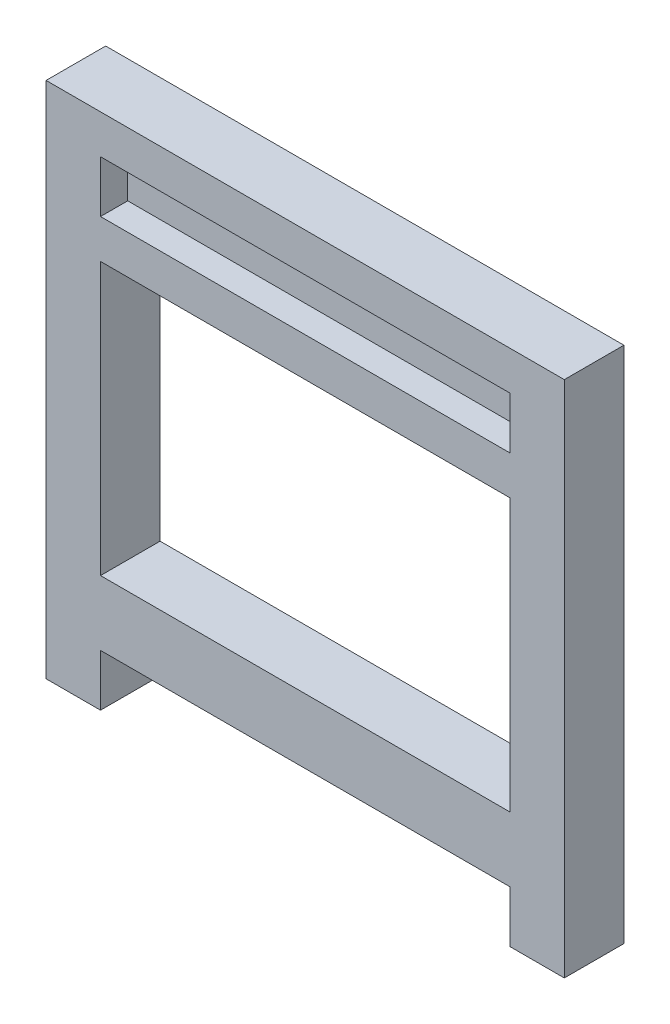
ISO-10303-21;
HEADER;
FILE_DESCRIPTION(('STEP AP214'),'2;1');
FILE_NAME('part.step','',(''),(''),'','','');
FILE_SCHEMA(('AUTOMOTIVE_DESIGN { 1 0 10303 214 1 1 1 1 }'));
ENDSEC;
DATA;
#1=APPLICATION_CONTEXT('core data for automotive mechanical design processes');
#2=APPLICATION_PROTOCOL_DEFINITION('international standard','automotive_design',2000,#1);
#3=PRODUCT_CONTEXT('',#1,'mechanical');
#4=PRODUCT('Part','Part','',(#3));
#5=PRODUCT_RELATED_PRODUCT_CATEGORY('part','',(#4));
#6=PRODUCT_DEFINITION_FORMATION('','',#4);
#7=PRODUCT_DEFINITION_CONTEXT('part definition',#1,'design');
#8=PRODUCT_DEFINITION('design','',#6,#7);
#9=PRODUCT_DEFINITION_SHAPE('','',#8);
#10=(LENGTH_UNIT() NAMED_UNIT(*) SI_UNIT(.MILLI.,.METRE.));
#11=(NAMED_UNIT(*) PLANE_ANGLE_UNIT() SI_UNIT($,.RADIAN.));
#12=(NAMED_UNIT(*) SI_UNIT($,.STERADIAN.) SOLID_ANGLE_UNIT());
#13=UNCERTAINTY_MEASURE_WITH_UNIT(LENGTH_MEASURE(1.E-05),#10,'distance_accuracy_value','');
#14=(GEOMETRIC_REPRESENTATION_CONTEXT(3) GLOBAL_UNCERTAINTY_ASSIGNED_CONTEXT((#13)) GLOBAL_UNIT_ASSIGNED_CONTEXT((#10,
#11,#12)) REPRESENTATION_CONTEXT('',''));
#15=CARTESIAN_POINT('',(0.,0.,0.));
#16=DIRECTION('',(0.,0.,1.));
#17=DIRECTION('',(1.,0.,0.));
#18=AXIS2_PLACEMENT_3D('',#15,#16,#17);
#19=CARTESIAN_POINT('',(2.1,14.5,2.3));
#20=DIRECTION('',(1.,0.,0.));
#21=DIRECTION('',(0.,0.,-1.));
#22=AXIS2_PLACEMENT_3D('',#19,#20,#21);
#23=PLANE('',#22);
#24=DIRECTION('',(0.,0.,-1.));
#25=VECTOR('',#24,1.);
#26=CARTESIAN_POINT('',(2.1,14.5,2.3));
#27=LINE('',#26,#25);
#28=CARTESIAN_POINT('',(2.1,14.5,2.3));
#29=VERTEX_POINT('',#28);
#30=CARTESIAN_POINT('',(2.1,14.5,1.25));
#31=VERTEX_POINT('',#30);
#32=EDGE_CURVE('E170',#29,#31,#27,.T.);
#33=ORIENTED_EDGE('',*,*,#32,.T.);
#34=DIRECTION('',(0.,1.,0.));
#35=VECTOR('',#34,1.);
#36=CARTESIAN_POINT('',(2.1,14.5,1.25));
#37=LINE('',#36,#35);
#38=CARTESIAN_POINT('',(2.1,16.5,1.25));
#39=VERTEX_POINT('',#38);
#40=EDGE_CURVE('E159',#31,#39,#37,.T.);
#41=ORIENTED_EDGE('',*,*,#40,.T.);
#42=DIRECTION('',(0.,0.,-1.));
#43=VECTOR('',#42,1.);
#44=CARTESIAN_POINT('',(2.1,16.5,2.3));
#45=LINE('',#44,#43);
#46=CARTESIAN_POINT('',(2.1,16.5,2.3));
#47=VERTEX_POINT('',#46);
#48=EDGE_CURVE('E167',#47,#39,#45,.T.);
#49=ORIENTED_EDGE('',*,*,#48,.F.);
#50=DIRECTION('',(0.,-1.,0.));
#51=VECTOR('',#50,1.);
#52=CARTESIAN_POINT('',(2.1,14.5,2.3));
#53=LINE('',#52,#51);
#54=EDGE_CURVE('E529',#47,#29,#53,.T.);
#55=ORIENTED_EDGE('',*,*,#54,.T.);
#56=EDGE_LOOP('',(#33,#41,#49,#55));
#57=FACE_BOUND('',#56,.T.);
#58=ADVANCED_FACE('F45',(#57),#23,.T.);
#59=CARTESIAN_POINT('',(2.1,14.5,2.3));
#60=DIRECTION('',(0.,1.,0.));
#61=DIRECTION('',(0.,0.,1.));
#62=AXIS2_PLACEMENT_3D('',#59,#60,#61);
#63=PLANE('',#62);
#64=DIRECTION('',(0.,0.,-1.));
#65=VECTOR('',#64,1.);
#66=CARTESIAN_POINT('',(17.9,14.5,2.3));
#67=LINE('',#66,#65);
#68=CARTESIAN_POINT('',(17.9,14.5,2.3));
#69=VERTEX_POINT('',#68);
#70=CARTESIAN_POINT('',(17.9,14.5,1.25));
#71=VERTEX_POINT('',#70);
#72=EDGE_CURVE('E180',#69,#71,#67,.T.);
#73=ORIENTED_EDGE('',*,*,#72,.T.);
#74=DIRECTION('',(1.,0.,0.));
#75=VECTOR('',#74,1.);
#76=CARTESIAN_POINT('',(2.1,14.5,1.25));
#77=LINE('',#76,#75);
#78=EDGE_CURVE('E531',#31,#71,#77,.T.);
#79=ORIENTED_EDGE('',*,*,#78,.F.);
#80=ORIENTED_EDGE('',*,*,#32,.F.);
#81=DIRECTION('',(1.,0.,0.));
#82=VECTOR('',#81,1.);
#83=CARTESIAN_POINT('',(2.1,14.5,2.3));
#84=LINE('',#83,#82);
#85=EDGE_CURVE('E528',#29,#69,#84,.T.);
#86=ORIENTED_EDGE('',*,*,#85,.T.);
#87=EDGE_LOOP('',(#73,#79,#80,#86));
#88=FACE_BOUND('',#87,.T.);
#89=ADVANCED_FACE('F361',(#88),#63,.T.);
#90=CARTESIAN_POINT('',(17.9,14.5,2.3));
#91=DIRECTION('',(-1.,0.,0.));
#92=DIRECTION('',(0.,0.,1.));
#93=AXIS2_PLACEMENT_3D('',#90,#91,#92);
#94=PLANE('',#93);
#95=DIRECTION('',(0.,0.,-1.));
#96=VECTOR('',#95,1.);
#97=CARTESIAN_POINT('',(17.9,16.5,2.3));
#98=LINE('',#97,#96);
#99=CARTESIAN_POINT('',(17.9,16.5,2.3));
#100=VERTEX_POINT('',#99);
#101=CARTESIAN_POINT('',(17.9,16.5,1.25));
#102=VERTEX_POINT('',#101);
#103=EDGE_CURVE('E68',#100,#102,#98,.T.);
#104=ORIENTED_EDGE('',*,*,#103,.T.);
#105=DIRECTION('',(0.,1.,0.));
#106=VECTOR('',#105,1.);
#107=CARTESIAN_POINT('',(17.9,14.5,1.25));
#108=LINE('',#107,#106);
#109=EDGE_CURVE('E61',#71,#102,#108,.T.);
#110=ORIENTED_EDGE('',*,*,#109,.F.);
#111=ORIENTED_EDGE('',*,*,#72,.F.);
#112=DIRECTION('',(0.,1.,0.));
#113=VECTOR('',#112,1.);
#114=CARTESIAN_POINT('',(17.9,14.5,2.3));
#115=LINE('',#114,#113);
#116=EDGE_CURVE('E182',#69,#100,#115,.T.);
#117=ORIENTED_EDGE('',*,*,#116,.T.);
#118=EDGE_LOOP('',(#104,#110,#111,#117));
#119=FACE_BOUND('',#118,.T.);
#120=ADVANCED_FACE('F367',(#119),#94,.T.);
#121=CARTESIAN_POINT('',(2.1,16.5,2.3));
#122=DIRECTION('',(0.,-1.,0.));
#123=DIRECTION('',(0.,0.,-1.));
#124=AXIS2_PLACEMENT_3D('',#121,#122,#123);
#125=PLANE('',#124);
#126=ORIENTED_EDGE('',*,*,#48,.T.);
#127=DIRECTION('',(1.,0.,0.));
#128=VECTOR('',#127,1.);
#129=CARTESIAN_POINT('',(2.1,16.5,1.25));
#130=LINE('',#129,#128);
#131=EDGE_CURVE('E156',#39,#102,#130,.T.);
#132=ORIENTED_EDGE('',*,*,#131,.T.);
#133=ORIENTED_EDGE('',*,*,#103,.F.);
#134=DIRECTION('',(-1.,0.,0.));
#135=VECTOR('',#134,1.);
#136=CARTESIAN_POINT('',(2.1,16.5,2.3));
#137=LINE('',#136,#135);
#138=EDGE_CURVE('E175',#100,#47,#137,.T.);
#139=ORIENTED_EDGE('',*,*,#138,.T.);
#140=EDGE_LOOP('',(#126,#132,#133,#139));
#141=FACE_BOUND('',#140,.T.);
#142=ADVANCED_FACE('F173',(#141),#125,.T.);
#143=CARTESIAN_POINT('',(0.,0.,2.3));
#144=DIRECTION('',(0.,0.,-1.));
#145=DIRECTION('',(-1.,0.,0.));
#146=AXIS2_PLACEMENT_3D('',#143,#144,#145);
#147=PLANE('',#146);
#148=DIRECTION('',(0.,1.,0.));
#149=VECTOR('',#148,1.);
#150=CARTESIAN_POINT('',(17.9,2.5,2.3));
#151=LINE('',#150,#149);
#152=CARTESIAN_POINT('',(17.9,2.5,2.3));
#153=VERTEX_POINT('',#152);
#154=CARTESIAN_POINT('',(17.9,13.,2.3));
#155=VERTEX_POINT('',#154);
#156=EDGE_CURVE('E192',#153,#155,#151,.T.);
#157=ORIENTED_EDGE('',*,*,#156,.F.);
#158=DIRECTION('',(1.,0.,0.));
#159=VECTOR('',#158,1.);
#160=CARTESIAN_POINT('',(2.1,2.5,2.3));
#161=LINE('',#160,#159);
#162=CARTESIAN_POINT('',(2.1,2.5,2.3));
#163=VERTEX_POINT('',#162);
#164=EDGE_CURVE('E203',#163,#153,#161,.T.);
#165=ORIENTED_EDGE('',*,*,#164,.F.);
#166=DIRECTION('',(0.,-1.,0.));
#167=VECTOR('',#166,1.);
#168=CARTESIAN_POINT('',(2.1,2.5,2.3));
#169=LINE('',#168,#167);
#170=CARTESIAN_POINT('',(2.1,13.,2.3));
#171=VERTEX_POINT('',#170);
#172=EDGE_CURVE('E199',#171,#163,#169,.T.);
#173=ORIENTED_EDGE('',*,*,#172,.F.);
#174=DIRECTION('',(-1.,0.,0.));
#175=VECTOR('',#174,1.);
#176=CARTESIAN_POINT('',(2.1,13.,2.3));
#177=LINE('',#176,#175);
#178=EDGE_CURVE('E195',#155,#171,#177,.T.);
#179=ORIENTED_EDGE('',*,*,#178,.F.);
#180=EDGE_LOOP('',(#157,#165,#173,#179));
#181=FACE_BOUND('',#180,.T.);
#182=DIRECTION('',(0.,-1.,0.));
#183=VECTOR('',#182,1.);
#184=CARTESIAN_POINT('',(0.,0.,2.3));
#185=LINE('',#184,#183);
#186=CARTESIAN_POINT('',(0.,18.,2.3));
#187=VERTEX_POINT('',#186);
#188=CARTESIAN_POINT('',(0.,-2.,2.3));
#189=VERTEX_POINT('',#188);
#190=EDGE_CURVE('E235',#187,#189,#185,.T.);
#191=ORIENTED_EDGE('',*,*,#190,.T.);
#192=DIRECTION('',(1.,0.,0.));
#193=VECTOR('',#192,1.);
#194=CARTESIAN_POINT('',(0.,-2.,2.3));
#195=LINE('',#194,#193);
#196=CARTESIAN_POINT('',(2.1,-2.,2.3));
#197=VERTEX_POINT('',#196);
#198=EDGE_CURVE('E238',#189,#197,#195,.T.);
#199=ORIENTED_EDGE('',*,*,#198,.T.);
#200=DIRECTION('',(0.,1.,0.));
#201=VECTOR('',#200,1.);
#202=CARTESIAN_POINT('',(2.1,-2.,2.3));
#203=LINE('',#202,#201);
#204=CARTESIAN_POINT('',(2.1,0.,2.3));
#205=VERTEX_POINT('',#204);
#206=EDGE_CURVE('E242',#197,#205,#203,.T.);
#207=ORIENTED_EDGE('',*,*,#206,.T.);
#208=DIRECTION('',(1.,0.,0.));
#209=VECTOR('',#208,1.);
#210=CARTESIAN_POINT('',(2.1,0.,2.3));
#211=LINE('',#210,#209);
#212=CARTESIAN_POINT('',(17.9,0.,2.3));
#213=VERTEX_POINT('',#212);
#214=EDGE_CURVE('E245',#205,#213,#211,.T.);
#215=ORIENTED_EDGE('',*,*,#214,.T.);
#216=DIRECTION('',(0.,-1.,0.));
#217=VECTOR('',#216,1.);
#218=CARTESIAN_POINT('',(17.9,-2.,2.3));
#219=LINE('',#218,#217);
#220=CARTESIAN_POINT('',(17.9,-2.,2.3));
#221=VERTEX_POINT('',#220);
#222=EDGE_CURVE('E248',#213,#221,#219,.T.);
#223=ORIENTED_EDGE('',*,*,#222,.T.);
#224=DIRECTION('',(1.,0.,0.));
#225=VECTOR('',#224,1.);
#226=CARTESIAN_POINT('',(20.,-2.,2.3));
#227=LINE('',#226,#225);
#228=CARTESIAN_POINT('',(20.,-2.,2.3));
#229=VERTEX_POINT('',#228);
#230=EDGE_CURVE('E251',#221,#229,#227,.T.);
#231=ORIENTED_EDGE('',*,*,#230,.T.);
#232=DIRECTION('',(0.,1.,0.));
#233=VECTOR('',#232,1.);
#234=CARTESIAN_POINT('',(20.,0.,2.3));
#235=LINE('',#234,#233);
#236=CARTESIAN_POINT('',(20.,18.,2.3));
#237=VERTEX_POINT('',#236);
#238=EDGE_CURVE('E254',#229,#237,#235,.T.);
#239=ORIENTED_EDGE('',*,*,#238,.T.);
#240=DIRECTION('',(-1.,0.,0.));
#241=VECTOR('',#240,1.);
#242=CARTESIAN_POINT('',(0.,18.,2.3));
#243=LINE('',#242,#241);
#244=EDGE_CURVE('E257',#237,#187,#243,.T.);
#245=ORIENTED_EDGE('',*,*,#244,.T.);
#246=EDGE_LOOP('',(#191,#199,#207,#215,#223,#231,#239,#245));
#247=FACE_BOUND('',#246,.T.);
#248=ORIENTED_EDGE('',*,*,#54,.F.);
#249=ORIENTED_EDGE('',*,*,#138,.F.);
#250=ORIENTED_EDGE('',*,*,#116,.F.);
#251=ORIENTED_EDGE('',*,*,#85,.F.);
#252=EDGE_LOOP('',(#248,#249,#250,#251));
#253=FACE_BOUND('',#252,.T.);
#254=ADVANCED_FACE('F334',(#181,#247,#253),#147,.F.);
#255=CARTESIAN_POINT('',(0.,0.,0.));
#256=DIRECTION('',(0.,0.,-1.));
#257=DIRECTION('',(-1.,0.,0.));
#258=AXIS2_PLACEMENT_3D('',#255,#256,#257);
#259=PLANE('',#258);
#260=DIRECTION('',(0.,-1.,0.));
#261=VECTOR('',#260,1.);
#262=CARTESIAN_POINT('',(0.,0.,0.));
#263=LINE('',#262,#261);
#264=CARTESIAN_POINT('',(0.,18.,0.));
#265=VERTEX_POINT('',#264);
#266=CARTESIAN_POINT('',(0.,-2.,0.));
#267=VERTEX_POINT('',#266);
#268=EDGE_CURVE('E234',#265,#267,#263,.T.);
#269=ORIENTED_EDGE('',*,*,#268,.F.);
#270=DIRECTION('',(-1.,0.,0.));
#271=VECTOR('',#270,1.);
#272=CARTESIAN_POINT('',(0.,18.,0.));
#273=LINE('',#272,#271);
#274=CARTESIAN_POINT('',(20.,18.,0.));
#275=VERTEX_POINT('',#274);
#276=EDGE_CURVE('E239',#275,#265,#273,.T.);
#277=ORIENTED_EDGE('',*,*,#276,.F.);
#278=DIRECTION('',(0.,1.,0.));
#279=VECTOR('',#278,1.);
#280=CARTESIAN_POINT('',(20.,0.,0.));
#281=LINE('',#280,#279);
#282=CARTESIAN_POINT('',(20.,-2.,0.));
#283=VERTEX_POINT('',#282);
#284=EDGE_CURVE('E279',#283,#275,#281,.T.);
#285=ORIENTED_EDGE('',*,*,#284,.F.);
#286=DIRECTION('',(1.,0.,0.));
#287=VECTOR('',#286,1.);
#288=CARTESIAN_POINT('',(20.,-2.,0.));
#289=LINE('',#288,#287);
#290=CARTESIAN_POINT('',(17.9,-2.,0.));
#291=VERTEX_POINT('',#290);
#292=EDGE_CURVE('E275',#291,#283,#289,.T.);
#293=ORIENTED_EDGE('',*,*,#292,.F.);
#294=DIRECTION('',(0.,-1.,0.));
#295=VECTOR('',#294,1.);
#296=CARTESIAN_POINT('',(17.9,-2.,0.));
#297=LINE('',#296,#295);
#298=CARTESIAN_POINT('',(17.9,0.,0.));
#299=VERTEX_POINT('',#298);
#300=EDGE_CURVE('E272',#299,#291,#297,.T.);
#301=ORIENTED_EDGE('',*,*,#300,.F.);
#302=DIRECTION('',(1.,0.,0.));
#303=VECTOR('',#302,1.);
#304=CARTESIAN_POINT('',(2.1,0.,0.));
#305=LINE('',#304,#303);
#306=CARTESIAN_POINT('',(2.1,0.,0.));
#307=VERTEX_POINT('',#306);
#308=EDGE_CURVE('E269',#307,#299,#305,.T.);
#309=ORIENTED_EDGE('',*,*,#308,.F.);
#310=DIRECTION('',(0.,1.,0.));
#311=VECTOR('',#310,1.);
#312=CARTESIAN_POINT('',(2.1,-2.,0.));
#313=LINE('',#312,#311);
#314=CARTESIAN_POINT('',(2.1,-2.,0.));
#315=VERTEX_POINT('',#314);
#316=EDGE_CURVE('E266',#315,#307,#313,.T.);
#317=ORIENTED_EDGE('',*,*,#316,.F.);
#318=DIRECTION('',(1.,0.,0.));
#319=VECTOR('',#318,1.);
#320=CARTESIAN_POINT('',(0.,-2.,0.));
#321=LINE('',#320,#319);
#322=EDGE_CURVE('E263',#267,#315,#321,.T.);
#323=ORIENTED_EDGE('',*,*,#322,.F.);
#324=EDGE_LOOP('',(#269,#277,#285,#293,#301,#309,#317,#323));
#325=FACE_BOUND('',#324,.T.);
#326=DIRECTION('',(1.,0.,0.));
#327=VECTOR('',#326,1.);
#328=CARTESIAN_POINT('',(2.1,2.5,0.));
#329=LINE('',#328,#327);
#330=CARTESIAN_POINT('',(2.1,2.5,0.));
#331=VERTEX_POINT('',#330);
#332=CARTESIAN_POINT('',(17.9,2.5,0.));
#333=VERTEX_POINT('',#332);
#334=EDGE_CURVE('E196',#331,#333,#329,.T.);
#335=ORIENTED_EDGE('',*,*,#334,.T.);
#336=DIRECTION('',(0.,1.,0.));
#337=VECTOR('',#336,1.);
#338=CARTESIAN_POINT('',(17.9,2.5,0.));
#339=LINE('',#338,#337);
#340=CARTESIAN_POINT('',(17.9,13.,0.));
#341=VERTEX_POINT('',#340);
#342=EDGE_CURVE('E191',#333,#341,#339,.T.);
#343=ORIENTED_EDGE('',*,*,#342,.T.);
#344=DIRECTION('',(-1.,0.,0.));
#345=VECTOR('',#344,1.);
#346=CARTESIAN_POINT('',(2.1,13.,0.));
#347=LINE('',#346,#345);
#348=CARTESIAN_POINT('',(2.1,13.,0.));
#349=VERTEX_POINT('',#348);
#350=EDGE_CURVE('E210',#341,#349,#347,.T.);
#351=ORIENTED_EDGE('',*,*,#350,.T.);
#352=DIRECTION('',(0.,-1.,0.));
#353=VECTOR('',#352,1.);
#354=CARTESIAN_POINT('',(2.1,2.5,0.));
#355=LINE('',#354,#353);
#356=EDGE_CURVE('E214',#349,#331,#355,.T.);
#357=ORIENTED_EDGE('',*,*,#356,.T.);
#358=EDGE_LOOP('',(#335,#343,#351,#357));
#359=FACE_BOUND('',#358,.T.);
#360=ADVANCED_FACE('F320',(#325,#359),#259,.T.);
#361=CARTESIAN_POINT('',(0.,0.,2.3));
#362=DIRECTION('',(1.,0.,0.));
#363=DIRECTION('',(0.,1.,0.));
#364=AXIS2_PLACEMENT_3D('',#361,#362,#363);
#365=PLANE('',#364);
#366=ORIENTED_EDGE('',*,*,#268,.T.);
#367=DIRECTION('',(0.,0.,-1.));
#368=VECTOR('',#367,1.);
#369=CARTESIAN_POINT('',(0.,-2.,2.3));
#370=LINE('',#369,#368);
#371=EDGE_CURVE('E11',#189,#267,#370,.T.);
#372=ORIENTED_EDGE('',*,*,#371,.F.);
#373=ORIENTED_EDGE('',*,*,#190,.F.);
#374=DIRECTION('',(0.,0.,-1.));
#375=VECTOR('',#374,1.);
#376=CARTESIAN_POINT('',(0.,18.,2.3));
#377=LINE('',#376,#375);
#378=EDGE_CURVE('E260',#187,#265,#377,.T.);
#379=ORIENTED_EDGE('',*,*,#378,.T.);
#380=EDGE_LOOP('',(#366,#372,#373,#379));
#381=FACE_BOUND('',#380,.T.);
#382=ADVANCED_FACE('F47',(#381),#365,.F.);
#383=CARTESIAN_POINT('',(0.,-2.,2.3));
#384=DIRECTION('',(0.,1.,0.));
#385=DIRECTION('',(0.,0.,1.));
#386=AXIS2_PLACEMENT_3D('',#383,#384,#385);
#387=PLANE('',#386);
#388=ORIENTED_EDGE('',*,*,#322,.T.);
#389=DIRECTION('',(0.,0.,-1.));
#390=VECTOR('',#389,1.);
#391=CARTESIAN_POINT('',(2.1,-2.,2.3));
#392=LINE('',#391,#390);
#393=EDGE_CURVE('E54',#197,#315,#392,.T.);
#394=ORIENTED_EDGE('',*,*,#393,.F.);
#395=ORIENTED_EDGE('',*,*,#198,.F.);
#396=ORIENTED_EDGE('',*,*,#371,.T.);
#397=EDGE_LOOP('',(#388,#394,#395,#396));
#398=FACE_BOUND('',#397,.T.);
#399=ADVANCED_FACE('F339',(#398),#387,.F.);
#400=CARTESIAN_POINT('',(2.1,-2.,2.3));
#401=DIRECTION('',(-1.,0.,0.));
#402=DIRECTION('',(0.,0.,1.));
#403=AXIS2_PLACEMENT_3D('',#400,#401,#402);
#404=PLANE('',#403);
#405=ORIENTED_EDGE('',*,*,#316,.T.);
#406=DIRECTION('',(0.,0.,-1.));
#407=VECTOR('',#406,1.);
#408=CARTESIAN_POINT('',(2.1,0.,2.3));
#409=LINE('',#408,#407);
#410=EDGE_CURVE('E304',#205,#307,#409,.T.);
#411=ORIENTED_EDGE('',*,*,#410,.F.);
#412=ORIENTED_EDGE('',*,*,#206,.F.);
#413=ORIENTED_EDGE('',*,*,#393,.T.);
#414=EDGE_LOOP('',(#405,#411,#412,#413));
#415=FACE_BOUND('',#414,.T.);
#416=ADVANCED_FACE('F313',(#415),#404,.F.);
#417=CARTESIAN_POINT('',(2.1,0.,2.3));
#418=DIRECTION('',(0.,1.,0.));
#419=DIRECTION('',(0.,0.,1.));
#420=AXIS2_PLACEMENT_3D('',#417,#418,#419);
#421=PLANE('',#420);
#422=ORIENTED_EDGE('',*,*,#308,.T.);
#423=DIRECTION('',(0.,0.,-1.));
#424=VECTOR('',#423,1.);
#425=CARTESIAN_POINT('',(17.9,0.,2.3));
#426=LINE('',#425,#424);
#427=EDGE_CURVE('E300',#213,#299,#426,.T.);
#428=ORIENTED_EDGE('',*,*,#427,.F.);
#429=ORIENTED_EDGE('',*,*,#214,.F.);
#430=ORIENTED_EDGE('',*,*,#410,.T.);
#431=EDGE_LOOP('',(#422,#428,#429,#430));
#432=FACE_BOUND('',#431,.T.);
#433=ADVANCED_FACE('F326',(#432),#421,.F.);
#434=CARTESIAN_POINT('',(17.9,-2.,2.3));
#435=DIRECTION('',(1.,0.,0.));
#436=DIRECTION('',(0.,0.,-1.));
#437=AXIS2_PLACEMENT_3D('',#434,#435,#436);
#438=PLANE('',#437);
#439=ORIENTED_EDGE('',*,*,#300,.T.);
#440=DIRECTION('',(0.,0.,-1.));
#441=VECTOR('',#440,1.);
#442=CARTESIAN_POINT('',(17.9,-2.,2.3));
#443=LINE('',#442,#441);
#444=EDGE_CURVE('E296',#221,#291,#443,.T.);
#445=ORIENTED_EDGE('',*,*,#444,.F.);
#446=ORIENTED_EDGE('',*,*,#222,.F.);
#447=ORIENTED_EDGE('',*,*,#427,.T.);
#448=EDGE_LOOP('',(#439,#445,#446,#447));
#449=FACE_BOUND('',#448,.T.);
#450=ADVANCED_FACE('F330',(#449),#438,.F.);
#451=CARTESIAN_POINT('',(20.,-2.,2.3));
#452=DIRECTION('',(0.,1.,0.));
#453=DIRECTION('',(-1.,0.,0.));
#454=AXIS2_PLACEMENT_3D('',#451,#452,#453);
#455=PLANE('',#454);
#456=ORIENTED_EDGE('',*,*,#292,.T.);
#457=DIRECTION('',(0.,0.,-1.));
#458=VECTOR('',#457,1.);
#459=CARTESIAN_POINT('',(20.,-2.,2.3));
#460=LINE('',#459,#458);
#461=EDGE_CURVE('E292',#229,#283,#460,.T.);
#462=ORIENTED_EDGE('',*,*,#461,.F.);
#463=ORIENTED_EDGE('',*,*,#230,.F.);
#464=ORIENTED_EDGE('',*,*,#444,.T.);
#465=EDGE_LOOP('',(#456,#462,#463,#464));
#466=FACE_BOUND('',#465,.T.);
#467=ADVANCED_FACE('F351',(#466),#455,.F.);
#468=CARTESIAN_POINT('',(20.,0.,2.3));
#469=DIRECTION('',(-1.,0.,0.));
#470=DIRECTION('',(0.,0.,1.));
#471=AXIS2_PLACEMENT_3D('',#468,#469,#470);
#472=PLANE('',#471);
#473=ORIENTED_EDGE('',*,*,#284,.T.);
#474=DIRECTION('',(0.,0.,-1.));
#475=VECTOR('',#474,1.);
#476=CARTESIAN_POINT('',(20.,18.,2.3));
#477=LINE('',#476,#475);
#478=EDGE_CURVE('E288',#237,#275,#477,.T.);
#479=ORIENTED_EDGE('',*,*,#478,.F.);
#480=ORIENTED_EDGE('',*,*,#238,.F.);
#481=ORIENTED_EDGE('',*,*,#461,.T.);
#482=EDGE_LOOP('',(#473,#479,#480,#481));
#483=FACE_BOUND('',#482,.T.);
#484=ADVANCED_FACE('F349',(#483),#472,.F.);
#485=CARTESIAN_POINT('',(0.,18.,2.3));
#486=DIRECTION('',(0.,-1.,0.));
#487=DIRECTION('',(0.,0.,-1.));
#488=AXIS2_PLACEMENT_3D('',#485,#486,#487);
#489=PLANE('',#488);
#490=ORIENTED_EDGE('',*,*,#276,.T.);
#491=ORIENTED_EDGE('',*,*,#378,.F.);
#492=ORIENTED_EDGE('',*,*,#244,.F.);
#493=ORIENTED_EDGE('',*,*,#478,.T.);
#494=EDGE_LOOP('',(#490,#491,#492,#493));
#495=FACE_BOUND('',#494,.T.);
#496=ADVANCED_FACE('F344',(#495),#489,.F.);
#497=CARTESIAN_POINT('',(17.9,2.5,2.3));
#498=DIRECTION('',(-1.,0.,0.));
#499=DIRECTION('',(0.,0.,1.));
#500=AXIS2_PLACEMENT_3D('',#497,#498,#499);
#501=PLANE('',#500);
#502=ORIENTED_EDGE('',*,*,#342,.F.);
#503=DIRECTION('',(0.,0.,-1.));
#504=VECTOR('',#503,1.);
#505=CARTESIAN_POINT('',(17.9,2.5,2.3));
#506=LINE('',#505,#504);
#507=EDGE_CURVE('E206',#153,#333,#506,.T.);
#508=ORIENTED_EDGE('',*,*,#507,.F.);
#509=ORIENTED_EDGE('',*,*,#156,.T.);
#510=DIRECTION('',(0.,0.,-1.));
#511=VECTOR('',#510,1.);
#512=CARTESIAN_POINT('',(17.9,13.,2.3));
#513=LINE('',#512,#511);
#514=EDGE_CURVE('E230',#155,#341,#513,.T.);
#515=ORIENTED_EDGE('',*,*,#514,.T.);
#516=EDGE_LOOP('',(#502,#508,#509,#515));
#517=FACE_BOUND('',#516,.T.);
#518=ADVANCED_FACE('F382',(#517),#501,.T.);
#519=CARTESIAN_POINT('',(2.1,13.,2.3));
#520=DIRECTION('',(0.,-1.,0.));
#521=DIRECTION('',(0.,0.,-1.));
#522=AXIS2_PLACEMENT_3D('',#519,#520,#521);
#523=PLANE('',#522);
#524=ORIENTED_EDGE('',*,*,#350,.F.);
#525=ORIENTED_EDGE('',*,*,#514,.F.);
#526=ORIENTED_EDGE('',*,*,#178,.T.);
#527=DIRECTION('',(0.,0.,-1.));
#528=VECTOR('',#527,1.);
#529=CARTESIAN_POINT('',(2.1,13.,2.3));
#530=LINE('',#529,#528);
#531=EDGE_CURVE('E227',#171,#349,#530,.T.);
#532=ORIENTED_EDGE('',*,*,#531,.T.);
#533=EDGE_LOOP('',(#524,#525,#526,#532));
#534=FACE_BOUND('',#533,.T.);
#535=ADVANCED_FACE('F378',(#534),#523,.T.);
#536=CARTESIAN_POINT('',(2.1,2.5,2.3));
#537=DIRECTION('',(1.,0.,0.));
#538=DIRECTION('',(0.,0.,-1.));
#539=AXIS2_PLACEMENT_3D('',#536,#537,#538);
#540=PLANE('',#539);
#541=ORIENTED_EDGE('',*,*,#356,.F.);
#542=ORIENTED_EDGE('',*,*,#531,.F.);
#543=ORIENTED_EDGE('',*,*,#172,.T.);
#544=DIRECTION('',(0.,0.,-1.));
#545=VECTOR('',#544,1.);
#546=CARTESIAN_POINT('',(2.1,2.5,2.3));
#547=LINE('',#546,#545);
#548=EDGE_CURVE('E224',#163,#331,#547,.T.);
#549=ORIENTED_EDGE('',*,*,#548,.T.);
#550=EDGE_LOOP('',(#541,#542,#543,#549));
#551=FACE_BOUND('',#550,.T.);
#552=ADVANCED_FACE('F374',(#551),#540,.T.);
#553=CARTESIAN_POINT('',(2.1,2.5,2.3));
#554=DIRECTION('',(0.,1.,0.));
#555=DIRECTION('',(0.,0.,1.));
#556=AXIS2_PLACEMENT_3D('',#553,#554,#555);
#557=PLANE('',#556);
#558=ORIENTED_EDGE('',*,*,#334,.F.);
#559=ORIENTED_EDGE('',*,*,#548,.F.);
#560=ORIENTED_EDGE('',*,*,#164,.T.);
#561=ORIENTED_EDGE('',*,*,#507,.T.);
#562=EDGE_LOOP('',(#558,#559,#560,#561));
#563=FACE_BOUND('',#562,.T.);
#564=ADVANCED_FACE('F372',(#563),#557,.T.);
#565=CARTESIAN_POINT('',(0.,0.,1.25));
#566=DIRECTION('',(0.,0.,-1.));
#567=DIRECTION('',(-1.,0.,0.));
#568=AXIS2_PLACEMENT_3D('',#565,#566,#567);
#569=PLANE('',#568);
#570=ORIENTED_EDGE('',*,*,#40,.F.);
#571=ORIENTED_EDGE('',*,*,#78,.T.);
#572=ORIENTED_EDGE('',*,*,#109,.T.);
#573=ORIENTED_EDGE('',*,*,#131,.F.);
#574=EDGE_LOOP('',(#570,#571,#572,#573));
#575=FACE_BOUND('',#574,.T.);
#576=ADVANCED_FACE('F158',(#575),#569,.F.);
#577=CLOSED_SHELL('',(#58,#89,#120,#142,#254,#360,#382,#399,#416,#433,#450,#467,#484,#496,#518,
#535,#552,#564,#576));
#578=MANIFOLD_SOLID_BREP('B2',#577);
#579=ADVANCED_BREP_SHAPE_REPRESENTATION('',(#18,#578),#14);
#580=SHAPE_DEFINITION_REPRESENTATION(#9,#579);
ENDSEC;
END-ISO-10303-21;
